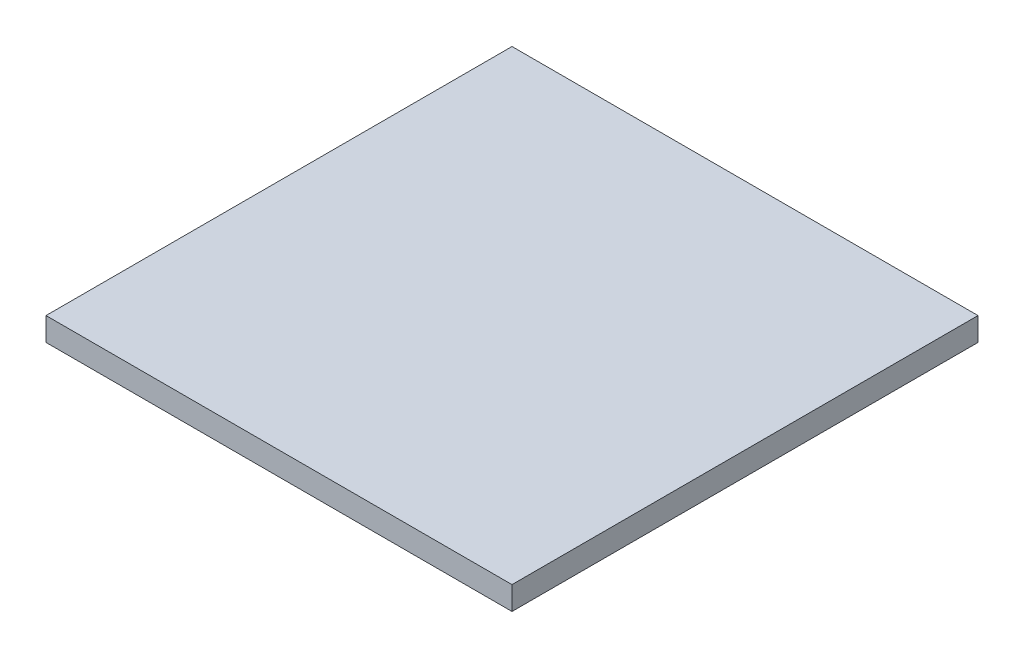
ISO-10303-21;
HEADER;
FILE_DESCRIPTION(('STEP AP214'),'2;1');
FILE_NAME('part.step','',(''),(''),'','','');
FILE_SCHEMA(('AUTOMOTIVE_DESIGN { 1 0 10303 214 1 1 1 1 }'));
ENDSEC;
DATA;
#1=APPLICATION_CONTEXT('core data for automotive mechanical design processes');
#2=APPLICATION_PROTOCOL_DEFINITION('international standard','automotive_design',2000,#1);
#3=PRODUCT_CONTEXT('',#1,'mechanical');
#4=PRODUCT('Part','Part','',(#3));
#5=PRODUCT_RELATED_PRODUCT_CATEGORY('part','',(#4));
#6=PRODUCT_DEFINITION_FORMATION('','',#4);
#7=PRODUCT_DEFINITION_CONTEXT('part definition',#1,'design');
#8=PRODUCT_DEFINITION('design','',#6,#7);
#9=PRODUCT_DEFINITION_SHAPE('','',#8);
#10=(LENGTH_UNIT() NAMED_UNIT(*) SI_UNIT(.MILLI.,.METRE.));
#11=(NAMED_UNIT(*) PLANE_ANGLE_UNIT() SI_UNIT($,.RADIAN.));
#12=(NAMED_UNIT(*) SI_UNIT($,.STERADIAN.) SOLID_ANGLE_UNIT());
#13=UNCERTAINTY_MEASURE_WITH_UNIT(LENGTH_MEASURE(1.E-05),#10,'distance_accuracy_value','');
#14=(GEOMETRIC_REPRESENTATION_CONTEXT(3) GLOBAL_UNCERTAINTY_ASSIGNED_CONTEXT((#13)) GLOBAL_UNIT_ASSIGNED_CONTEXT((#10,
#11,#12)) REPRESENTATION_CONTEXT('',''));
#15=CARTESIAN_POINT('',(0.,0.,0.));
#16=DIRECTION('',(0.,0.,1.));
#17=DIRECTION('',(1.,0.,0.));
#18=AXIS2_PLACEMENT_3D('',#15,#16,#17);
#19=CARTESIAN_POINT('',(-150.,15.,-150.));
#20=DIRECTION('',(1.,0.,0.));
#21=DIRECTION('',(0.,0.,1.));
#22=AXIS2_PLACEMENT_3D('',#19,#20,#21);
#23=PLANE('',#22);
#24=DIRECTION('',(0.,0.,-1.));
#25=VECTOR('',#24,1.);
#26=CARTESIAN_POINT('',(-150.,0.,-150.));
#27=LINE('',#26,#25);
#28=CARTESIAN_POINT('',(-150.,0.,150.));
#29=VERTEX_POINT('',#28);
#30=CARTESIAN_POINT('',(-150.,0.,-150.));
#31=VERTEX_POINT('',#30);
#32=EDGE_CURVE('E95',#29,#31,#27,.T.);
#33=ORIENTED_EDGE('',*,*,#32,.F.);
#34=DIRECTION('',(0.,-1.,0.));
#35=VECTOR('',#34,1.);
#36=CARTESIAN_POINT('',(-150.,15.,150.));
#37=LINE('',#36,#35);
#38=CARTESIAN_POINT('',(-150.,15.,150.));
#39=VERTEX_POINT('',#38);
#40=EDGE_CURVE('E94',#39,#29,#37,.T.);
#41=ORIENTED_EDGE('',*,*,#40,.F.);
#42=DIRECTION('',(0.,0.,-1.));
#43=VECTOR('',#42,1.);
#44=CARTESIAN_POINT('',(-150.,15.,-150.));
#45=LINE('',#44,#43);
#46=CARTESIAN_POINT('',(-150.,15.,-150.));
#47=VERTEX_POINT('',#46);
#48=EDGE_CURVE('E89',#39,#47,#45,.T.);
#49=ORIENTED_EDGE('',*,*,#48,.T.);
#50=DIRECTION('',(0.,-1.,0.));
#51=VECTOR('',#50,1.);
#52=CARTESIAN_POINT('',(-150.,15.,-150.));
#53=LINE('',#52,#51);
#54=EDGE_CURVE('E11',#47,#31,#53,.T.);
#55=ORIENTED_EDGE('',*,*,#54,.T.);
#56=EDGE_LOOP('',(#33,#41,#49,#55));
#57=FACE_BOUND('',#56,.T.);
#58=ADVANCED_FACE('F32',(#57),#23,.F.);
#59=CARTESIAN_POINT('',(150.,15.,-150.));
#60=DIRECTION('',(0.,0.,1.));
#61=DIRECTION('',(-1.,0.,0.));
#62=AXIS2_PLACEMENT_3D('',#59,#60,#61);
#63=PLANE('',#62);
#64=DIRECTION('',(1.,0.,0.));
#65=VECTOR('',#64,1.);
#66=CARTESIAN_POINT('',(150.,0.,-150.));
#67=LINE('',#66,#65);
#68=CARTESIAN_POINT('',(150.,0.,-150.));
#69=VERTEX_POINT('',#68);
#70=EDGE_CURVE('E97',#31,#69,#67,.T.);
#71=ORIENTED_EDGE('',*,*,#70,.F.);
#72=ORIENTED_EDGE('',*,*,#54,.F.);
#73=DIRECTION('',(1.,0.,0.));
#74=VECTOR('',#73,1.);
#75=CARTESIAN_POINT('',(150.,15.,-150.));
#76=LINE('',#75,#74);
#77=CARTESIAN_POINT('',(150.,15.,-150.));
#78=VERTEX_POINT('',#77);
#79=EDGE_CURVE('E73',#47,#78,#76,.T.);
#80=ORIENTED_EDGE('',*,*,#79,.T.);
#81=DIRECTION('',(0.,-1.,0.));
#82=VECTOR('',#81,1.);
#83=CARTESIAN_POINT('',(150.,15.,-150.));
#84=LINE('',#83,#82);
#85=EDGE_CURVE('E40',#78,#69,#84,.T.);
#86=ORIENTED_EDGE('',*,*,#85,.T.);
#87=EDGE_LOOP('',(#71,#72,#80,#86));
#88=FACE_BOUND('',#87,.T.);
#89=ADVANCED_FACE('F87',(#88),#63,.F.);
#90=CARTESIAN_POINT('',(150.,15.,-150.));
#91=DIRECTION('',(-1.,0.,0.));
#92=DIRECTION('',(0.,0.,-1.));
#93=AXIS2_PLACEMENT_3D('',#90,#91,#92);
#94=PLANE('',#93);
#95=DIRECTION('',(0.,0.,1.));
#96=VECTOR('',#95,1.);
#97=CARTESIAN_POINT('',(150.,0.,-150.));
#98=LINE('',#97,#96);
#99=CARTESIAN_POINT('',(150.,0.,150.));
#100=VERTEX_POINT('',#99);
#101=EDGE_CURVE('E83',#69,#100,#98,.T.);
#102=ORIENTED_EDGE('',*,*,#101,.F.);
#103=ORIENTED_EDGE('',*,*,#85,.F.);
#104=DIRECTION('',(0.,0.,1.));
#105=VECTOR('',#104,1.);
#106=CARTESIAN_POINT('',(150.,15.,-150.));
#107=LINE('',#106,#105);
#108=CARTESIAN_POINT('',(150.,15.,150.));
#109=VERTEX_POINT('',#108);
#110=EDGE_CURVE('E76',#78,#109,#107,.T.);
#111=ORIENTED_EDGE('',*,*,#110,.T.);
#112=DIRECTION('',(0.,-1.,0.));
#113=VECTOR('',#112,1.);
#114=CARTESIAN_POINT('',(150.,15.,150.));
#115=LINE('',#114,#113);
#116=EDGE_CURVE('E86',#109,#100,#115,.T.);
#117=ORIENTED_EDGE('',*,*,#116,.T.);
#118=EDGE_LOOP('',(#102,#103,#111,#117));
#119=FACE_BOUND('',#118,.T.);
#120=ADVANCED_FACE('F82',(#119),#94,.F.);
#121=CARTESIAN_POINT('',(150.,15.,150.));
#122=DIRECTION('',(0.,0.,-1.));
#123=DIRECTION('',(1.,0.,0.));
#124=AXIS2_PLACEMENT_3D('',#121,#122,#123);
#125=PLANE('',#124);
#126=DIRECTION('',(-1.,0.,0.));
#127=VECTOR('',#126,1.);
#128=CARTESIAN_POINT('',(150.,0.,150.));
#129=LINE('',#128,#127);
#130=EDGE_CURVE('E62',#100,#29,#129,.T.);
#131=ORIENTED_EDGE('',*,*,#130,.F.);
#132=ORIENTED_EDGE('',*,*,#116,.F.);
#133=DIRECTION('',(-1.,0.,0.));
#134=VECTOR('',#133,1.);
#135=CARTESIAN_POINT('',(150.,15.,150.));
#136=LINE('',#135,#134);
#137=EDGE_CURVE('E48',#109,#39,#136,.T.);
#138=ORIENTED_EDGE('',*,*,#137,.T.);
#139=ORIENTED_EDGE('',*,*,#40,.T.);
#140=EDGE_LOOP('',(#131,#132,#138,#139));
#141=FACE_BOUND('',#140,.T.);
#142=ADVANCED_FACE('F106',(#141),#125,.F.);
#143=CARTESIAN_POINT('',(0.,15.,0.));
#144=DIRECTION('',(0.,1.,0.));
#145=DIRECTION('',(0.,0.,1.));
#146=AXIS2_PLACEMENT_3D('',#143,#144,#145);
#147=PLANE('',#146);
#148=ORIENTED_EDGE('',*,*,#48,.F.);
#149=ORIENTED_EDGE('',*,*,#137,.F.);
#150=ORIENTED_EDGE('',*,*,#110,.F.);
#151=ORIENTED_EDGE('',*,*,#79,.F.);
#152=EDGE_LOOP('',(#148,#149,#150,#151));
#153=FACE_BOUND('',#152,.T.);
#154=ADVANCED_FACE('F78',(#153),#147,.T.);
#155=CARTESIAN_POINT('',(0.,0.,0.));
#156=DIRECTION('',(0.,1.,0.));
#157=DIRECTION('',(0.,0.,1.));
#158=AXIS2_PLACEMENT_3D('',#155,#156,#157);
#159=PLANE('',#158);
#160=ORIENTED_EDGE('',*,*,#32,.T.);
#161=ORIENTED_EDGE('',*,*,#70,.T.);
#162=ORIENTED_EDGE('',*,*,#101,.T.);
#163=ORIENTED_EDGE('',*,*,#130,.T.);
#164=EDGE_LOOP('',(#160,#161,#162,#163));
#165=FACE_BOUND('',#164,.T.);
#166=ADVANCED_FACE('F102',(#165),#159,.F.);
#167=CLOSED_SHELL('',(#58,#89,#120,#142,#154,#166));
#168=MANIFOLD_SOLID_BREP('B2',#167);
#169=ADVANCED_BREP_SHAPE_REPRESENTATION('',(#18,#168),#14);
#170=SHAPE_DEFINITION_REPRESENTATION(#9,#169);
ENDSEC;
END-ISO-10303-21;
